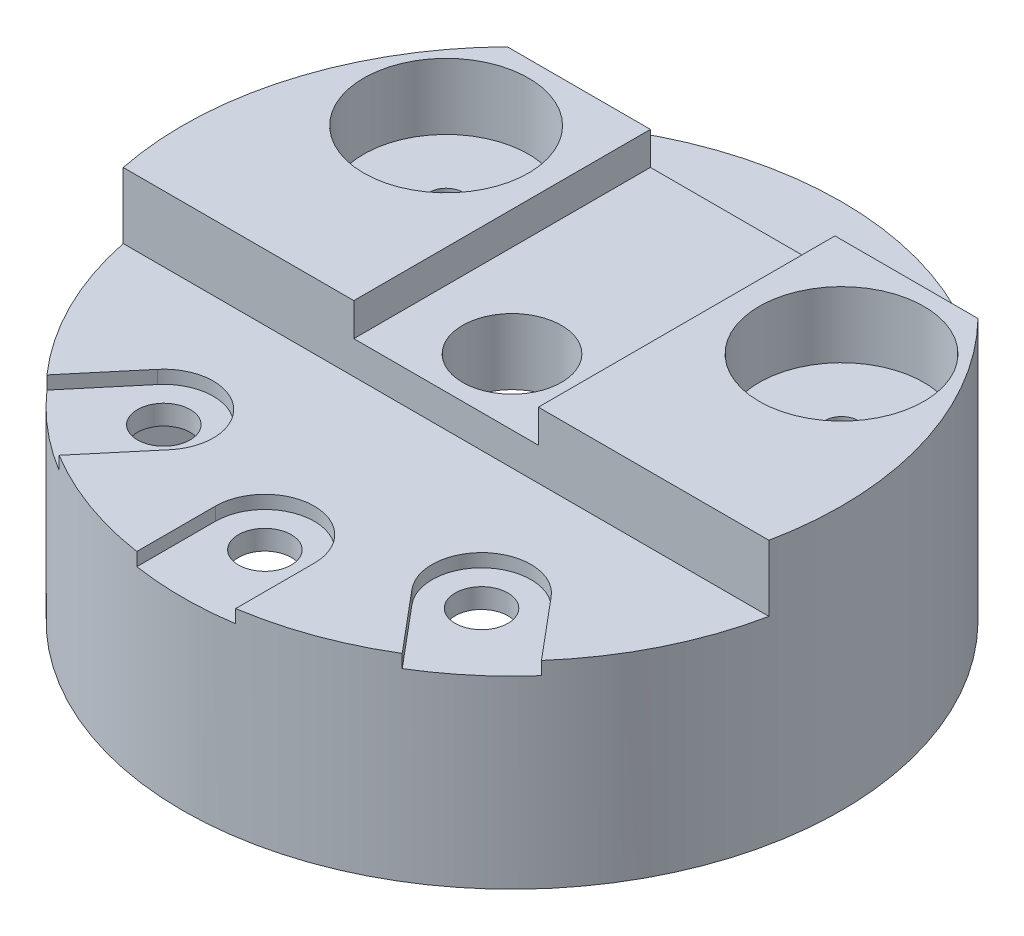
ISO-10303-21;
HEADER;
FILE_DESCRIPTION(('STEP AP214'),'2;1');
FILE_NAME('part.step','',(''),(''),'','','');
FILE_SCHEMA(('AUTOMOTIVE_DESIGN { 1 0 10303 214 1 1 1 1 }'));
ENDSEC;
DATA;
#1=APPLICATION_CONTEXT('core data for automotive mechanical design processes');
#2=APPLICATION_PROTOCOL_DEFINITION('international standard','automotive_design',2000,#1);
#3=PRODUCT_CONTEXT('',#1,'mechanical');
#4=PRODUCT('Part','Part','',(#3));
#5=PRODUCT_RELATED_PRODUCT_CATEGORY('part','',(#4));
#6=PRODUCT_DEFINITION_FORMATION('','',#4);
#7=PRODUCT_DEFINITION_CONTEXT('part definition',#1,'design');
#8=PRODUCT_DEFINITION('design','',#6,#7);
#9=PRODUCT_DEFINITION_SHAPE('','',#8);
#10=(LENGTH_UNIT() NAMED_UNIT(*) SI_UNIT(.MILLI.,.METRE.));
#11=(NAMED_UNIT(*) PLANE_ANGLE_UNIT() SI_UNIT($,.RADIAN.));
#12=(NAMED_UNIT(*) SI_UNIT($,.STERADIAN.) SOLID_ANGLE_UNIT());
#13=UNCERTAINTY_MEASURE_WITH_UNIT(LENGTH_MEASURE(1.E-05),#10,'distance_accuracy_value','');
#14=(GEOMETRIC_REPRESENTATION_CONTEXT(3) GLOBAL_UNCERTAINTY_ASSIGNED_CONTEXT((#13)) GLOBAL_UNIT_ASSIGNED_CONTEXT((#10,
#11,#12)) REPRESENTATION_CONTEXT('',''));
#15=CARTESIAN_POINT('',(0.,0.,0.));
#16=DIRECTION('',(0.,0.,1.));
#17=DIRECTION('',(1.,0.,0.));
#18=AXIS2_PLACEMENT_3D('',#15,#16,#17);
#19=CARTESIAN_POINT('',(0.,2.5,0.));
#20=DIRECTION('',(0.,1.,0.));
#21=DIRECTION('',(0.,0.,1.));
#22=AXIS2_PLACEMENT_3D('',#19,#20,#21);
#23=CYLINDRICAL_SURFACE('',#22,0.75);
#24=CARTESIAN_POINT('',(0.,2.5,0.));
#25=DIRECTION('',(0.,1.,0.));
#26=DIRECTION('',(0.,0.,1.));
#27=AXIS2_PLACEMENT_3D('',#24,#25,#26);
#28=CIRCLE('',#27,0.75);
#29=CARTESIAN_POINT('',(0.,2.5,0.75));
#30=VERTEX_POINT('',#29);
#31=EDGE_CURVE('E345',#30,#30,#28,.T.);
#32=ORIENTED_EDGE('',*,*,#31,.F.);
#33=EDGE_LOOP('',(#32));
#34=FACE_BOUND('',#33,.T.);
#35=CARTESIAN_POINT('',(0.,3.5,0.));
#36=DIRECTION('',(0.,1.,0.));
#37=DIRECTION('',(0.,0.,1.));
#38=AXIS2_PLACEMENT_3D('',#35,#36,#37);
#39=CIRCLE('',#38,0.75);
#40=CARTESIAN_POINT('',(0.,3.5,0.75));
#41=VERTEX_POINT('',#40);
#42=EDGE_CURVE('E280',#41,#41,#39,.F.);
#43=ORIENTED_EDGE('',*,*,#42,.F.);
#44=EDGE_LOOP('',(#43));
#45=FACE_BOUND('',#44,.T.);
#46=ADVANCED_FACE('F34',(#34,#45),#23,.F.);
#47=CARTESIAN_POINT('',(0.,4.,0.));
#48=DIRECTION('',(0.,-1.,0.));
#49=DIRECTION('',(0.,0.,-1.));
#50=AXIS2_PLACEMENT_3D('',#47,#48,#49);
#51=PLANE('',#50);
#52=CARTESIAN_POINT('',(3.,4.,-2.));
#53=DIRECTION('',(0.,1.,0.));
#54=DIRECTION('',(0.,0.,1.));
#55=AXIS2_PLACEMENT_3D('',#52,#53,#54);
#56=CIRCLE('',#55,1.25);
#57=CARTESIAN_POINT('',(3.,4.,-0.749999999999999));
#58=VERTEX_POINT('',#57);
#59=EDGE_CURVE('E309',#58,#58,#56,.T.);
#60=ORIENTED_EDGE('',*,*,#59,.F.);
#61=EDGE_LOOP('',(#60));
#62=FACE_BOUND('',#61,.T.);
#63=DIRECTION('',(-1.,0.,0.));
#64=VECTOR('',#63,1.);
#65=CARTESIAN_POINT('',(-3.57071421427143,4.,-3.5));
#66=LINE('',#65,#64);
#67=CARTESIAN_POINT('',(3.57071421427142,4.,-3.5));
#68=VERTEX_POINT('',#67);
#69=CARTESIAN_POINT('',(1.4,4.,-3.5));
#70=VERTEX_POINT('',#69);
#71=EDGE_CURVE('E326',#68,#70,#66,.T.);
#72=ORIENTED_EDGE('',*,*,#71,.T.);
#73=DIRECTION('',(0.,0.,-1.));
#74=VECTOR('',#73,1.);
#75=CARTESIAN_POINT('',(1.4,4.,-3.5));
#76=LINE('',#75,#74);
#77=CARTESIAN_POINT('',(1.4,4.,1.));
#78=VERTEX_POINT('',#77);
#79=EDGE_CURVE('E262',#78,#70,#76,.T.);
#80=ORIENTED_EDGE('',*,*,#79,.F.);
#81=DIRECTION('',(1.,0.,0.));
#82=VECTOR('',#81,1.);
#83=CARTESIAN_POINT('',(-4.89897948556636,4.,1.));
#84=LINE('',#83,#82);
#85=CARTESIAN_POINT('',(4.89897948556636,4.,1.));
#86=VERTEX_POINT('',#85);
#87=EDGE_CURVE('E318',#78,#86,#84,.T.);
#88=ORIENTED_EDGE('',*,*,#87,.T.);
#89=CARTESIAN_POINT('',(0.,4.,0.));
#90=DIRECTION('',(0.,1.,0.));
#91=DIRECTION('',(0.,0.,1.));
#92=AXIS2_PLACEMENT_3D('',#89,#90,#91);
#93=CIRCLE('',#92,5.);
#94=EDGE_CURVE('E323',#86,#68,#93,.T.);
#95=ORIENTED_EDGE('',*,*,#94,.T.);
#96=EDGE_LOOP('',(#72,#80,#88,#95));
#97=FACE_BOUND('',#96,.T.);
#98=ADVANCED_FACE('F418',(#62,#97),#51,.F.);
#99=CARTESIAN_POINT('',(0.,3.,0.));
#100=DIRECTION('',(0.,1.,0.));
#101=DIRECTION('',(0.,0.,1.));
#102=AXIS2_PLACEMENT_3D('',#99,#100,#101);
#103=PLANE('',#102);
#104=DIRECTION('',(-1.,0.,0.));
#105=VECTOR('',#104,1.);
#106=CARTESIAN_POINT('',(-3.57071421427143,3.,-3.5));
#107=LINE('',#106,#105);
#108=CARTESIAN_POINT('',(3.57071421427142,3.,-3.5));
#109=VERTEX_POINT('',#108);
#110=CARTESIAN_POINT('',(-3.57071421427142,3.,-3.5));
#111=VERTEX_POINT('',#110);
#112=EDGE_CURVE('E319',#109,#111,#107,.T.);
#113=ORIENTED_EDGE('',*,*,#112,.F.);
#114=CARTESIAN_POINT('',(0.,3.,0.));
#115=DIRECTION('',(0.,1.,0.));
#116=DIRECTION('',(0.,0.,1.));
#117=AXIS2_PLACEMENT_3D('',#114,#115,#116);
#118=CIRCLE('',#117,5.);
#119=EDGE_CURVE('E356',#109,#111,#118,.T.);
#120=ORIENTED_EDGE('',*,*,#119,.T.);
#121=EDGE_LOOP('',(#113,#120));
#122=FACE_BOUND('',#121,.T.);
#123=ADVANCED_FACE('F405',(#122),#103,.T.);
#124=CARTESIAN_POINT('',(0.,3.,0.));
#125=DIRECTION('',(0.,-1.,0.));
#126=DIRECTION('',(0.,0.,-1.));
#127=AXIS2_PLACEMENT_3D('',#124,#125,#126);
#128=CYLINDRICAL_SURFACE('',#127,4.75);
#129=CARTESIAN_POINT('',(0.,0.,0.));
#130=DIRECTION('',(0.,1.,0.));
#131=DIRECTION('',(0.,0.,1.));
#132=AXIS2_PLACEMENT_3D('',#129,#130,#131);
#133=CIRCLE('',#132,4.75);
#134=CARTESIAN_POINT('',(0.,0.,4.75));
#135=VERTEX_POINT('',#134);
#136=EDGE_CURVE('E349',#135,#135,#133,.T.);
#137=ORIENTED_EDGE('',*,*,#136,.F.);
#138=EDGE_LOOP('',(#137));
#139=FACE_BOUND('',#138,.T.);
#140=CARTESIAN_POINT('',(0.,2.5,0.));
#141=DIRECTION('',(0.,1.,0.));
#142=DIRECTION('',(0.,0.,1.));
#143=AXIS2_PLACEMENT_3D('',#140,#141,#142);
#144=CIRCLE('',#143,4.75);
#145=CARTESIAN_POINT('',(0.,2.5,4.75));
#146=VERTEX_POINT('',#145);
#147=EDGE_CURVE('E348',#146,#146,#144,.T.);
#148=ORIENTED_EDGE('',*,*,#147,.T.);
#149=EDGE_LOOP('',(#148));
#150=FACE_BOUND('',#149,.T.);
#151=ADVANCED_FACE('F456',(#139,#150),#128,.F.);
#152=DIRECTION('',(-0.642787609686541,0.,0.766044443118977));
#153=VECTOR('',#152,1.);
#154=CARTESIAN_POINT('',(-4.07772580513088,3.,3.69285150773352));
#155=LINE('',#154,#153);
#156=CARTESIAN_POINT('',(-2.98498686866376,3.,2.39057595443126));
#157=VERTEX_POINT('',#156);
#158=CARTESIAN_POINT('',(-3.7521088749711,3.,3.30479636140611));
#159=VERTEX_POINT('',#158);
#160=EDGE_CURVE('E180',#157,#159,#155,.T.);
#161=ORIENTED_EDGE('',*,*,#160,.F.);
#162=CARTESIAN_POINT('',(-2.41045353632453,3.,2.87266666169616));
#163=DIRECTION('',(0.,1.,0.));
#164=DIRECTION('',(0.,0.,-1.));
#165=AXIS2_PLACEMENT_3D('',#162,#163,#164);
#166=CIRCLE('',#165,0.749999999999999);
#167=CARTESIAN_POINT('',(-1.8359202039853,3.,3.35475736896107));
#168=VERTEX_POINT('',#167);
#169=EDGE_CURVE('E198',#168,#157,#166,.T.);
#170=ORIENTED_EDGE('',*,*,#169,.F.);
#171=DIRECTION('',(0.642787609686541,0.,-0.766044443118976));
#172=VECTOR('',#171,1.);
#173=CARTESIAN_POINT('',(-2.92865914045242,3.,4.65703292226333));
#174=LINE('',#173,#172);
#175=CARTESIAN_POINT('',(-2.60304221029264,3.,4.26897777593592));
#176=VERTEX_POINT('',#175);
#177=EDGE_CURVE('E186',#176,#168,#174,.T.);
#178=ORIENTED_EDGE('',*,*,#177,.F.);
#179=CARTESIAN_POINT('',(-0.75,3.,4.9434299833213));
#180=VERTEX_POINT('',#179);
#181=EDGE_CURVE('E357',#176,#180,#118,.T.);
#182=ORIENTED_EDGE('',*,*,#181,.T.);
#183=DIRECTION('',(0.,0.,1.));
#184=VECTOR('',#183,1.);
#185=CARTESIAN_POINT('',(-0.75,3.,3.75));
#186=LINE('',#185,#184);
#187=CARTESIAN_POINT('',(-0.75,3.,3.75));
#188=VERTEX_POINT('',#187);
#189=EDGE_CURVE('E242',#188,#180,#186,.T.);
#190=ORIENTED_EDGE('',*,*,#189,.F.);
#191=CARTESIAN_POINT('',(0.,3.,3.75));
#192=DIRECTION('',(0.,1.,0.));
#193=DIRECTION('',(0.,0.,-1.));
#194=AXIS2_PLACEMENT_3D('',#191,#192,#193);
#195=CIRCLE('',#194,0.75);
#196=CARTESIAN_POINT('',(0.75,3.,3.75));
#197=VERTEX_POINT('',#196);
#198=EDGE_CURVE('E230',#197,#188,#195,.T.);
#199=ORIENTED_EDGE('',*,*,#198,.F.);
#200=DIRECTION('',(0.,0.,-1.));
#201=VECTOR('',#200,1.);
#202=CARTESIAN_POINT('',(0.75,3.,5.45));
#203=LINE('',#202,#201);
#204=CARTESIAN_POINT('',(0.75,3.,4.9434299833213));
#205=VERTEX_POINT('',#204);
#206=EDGE_CURVE('E235',#205,#197,#203,.T.);
#207=ORIENTED_EDGE('',*,*,#206,.F.);
#208=CARTESIAN_POINT('',(2.60304221029264,3.,4.26897777593592));
#209=VERTEX_POINT('',#208);
#210=EDGE_CURVE('E406',#205,#209,#118,.T.);
#211=ORIENTED_EDGE('',*,*,#210,.T.);
#212=DIRECTION('',(0.642787609686541,0.,0.766044443118977));
#213=VECTOR('',#212,1.);
#214=CARTESIAN_POINT('',(1.8359202039853,3.,3.35475736896107));
#215=LINE('',#214,#213);
#216=CARTESIAN_POINT('',(1.8359202039853,3.,3.35475736896107));
#217=VERTEX_POINT('',#216);
#218=EDGE_CURVE('E216',#217,#209,#215,.T.);
#219=ORIENTED_EDGE('',*,*,#218,.F.);
#220=CARTESIAN_POINT('',(2.41045353632453,3.,2.87266666169616));
#221=DIRECTION('',(0.,1.,0.));
#222=DIRECTION('',(0.,0.,-1.));
#223=AXIS2_PLACEMENT_3D('',#220,#221,#222);
#224=CIRCLE('',#223,0.749999999999999);
#225=CARTESIAN_POINT('',(2.98498686866376,3.,2.39057595443126));
#226=VERTEX_POINT('',#225);
#227=EDGE_CURVE('E206',#226,#217,#224,.T.);
#228=ORIENTED_EDGE('',*,*,#227,.F.);
#229=DIRECTION('',(-0.642787609686541,0.,-0.766044443118977));
#230=VECTOR('',#229,1.);
#231=CARTESIAN_POINT('',(2.98498686866376,3.,2.39057595443126));
#232=LINE('',#231,#230);
#233=CARTESIAN_POINT('',(3.75210887497111,3.,3.30479636140611));
#234=VERTEX_POINT('',#233);
#235=EDGE_CURVE('E209',#234,#226,#232,.T.);
#236=ORIENTED_EDGE('',*,*,#235,.F.);
#237=CARTESIAN_POINT('',(4.89897948556636,3.,1.));
#238=VERTEX_POINT('',#237);
#239=EDGE_CURVE('E360',#234,#238,#118,.T.);
#240=ORIENTED_EDGE('',*,*,#239,.T.);
#241=DIRECTION('',(1.,0.,0.));
#242=VECTOR('',#241,1.);
#243=CARTESIAN_POINT('',(-4.89897948556636,3.,1.));
#244=LINE('',#243,#242);
#245=CARTESIAN_POINT('',(-4.89897948556636,3.,1.));
#246=VERTEX_POINT('',#245);
#247=EDGE_CURVE('E312',#246,#238,#244,.T.);
#248=ORIENTED_EDGE('',*,*,#247,.F.);
#249=EDGE_CURVE('E353',#246,#159,#118,.T.);
#250=ORIENTED_EDGE('',*,*,#249,.T.);
#251=EDGE_LOOP('',(#161,#170,#178,#182,#190,#199,#207,#211,#219,#228,#236,#240,#248,#250));
#252=FACE_BOUND('',#251,.T.);
#253=ADVANCED_FACE('F379',(#252),#103,.T.);
#254=CARTESIAN_POINT('',(0.,0.,0.));
#255=DIRECTION('',(0.,1.,0.));
#256=DIRECTION('',(0.,0.,1.));
#257=AXIS2_PLACEMENT_3D('',#254,#255,#256);
#258=PLANE('',#257);
#259=CARTESIAN_POINT('',(0.,0.,0.));
#260=DIRECTION('',(0.,1.,0.));
#261=DIRECTION('',(0.,0.,1.));
#262=AXIS2_PLACEMENT_3D('',#259,#260,#261);
#263=CIRCLE('',#262,5.);
#264=CARTESIAN_POINT('',(0.,0.,5.));
#265=VERTEX_POINT('',#264);
#266=EDGE_CURVE('E352',#265,#265,#263,.T.);
#267=ORIENTED_EDGE('',*,*,#266,.F.);
#268=EDGE_LOOP('',(#267));
#269=FACE_BOUND('',#268,.T.);
#270=ORIENTED_EDGE('',*,*,#136,.T.);
#271=EDGE_LOOP('',(#270));
#272=FACE_BOUND('',#271,.T.);
#273=ADVANCED_FACE('F461',(#269,#272),#258,.F.);
#274=CARTESIAN_POINT('',(0.,3.,0.));
#275=DIRECTION('',(0.,-1.,0.));
#276=DIRECTION('',(0.,0.,-1.));
#277=AXIS2_PLACEMENT_3D('',#274,#275,#276);
#278=CYLINDRICAL_SURFACE('',#277,5.);
#279=CARTESIAN_POINT('',(0.,2.8,0.));
#280=DIRECTION('',(0.,-1.,0.));
#281=DIRECTION('',(0.,0.,-1.));
#282=AXIS2_PLACEMENT_3D('',#279,#280,#281);
#283=CIRCLE('',#282,5.);
#284=CARTESIAN_POINT('',(-2.60304221029264,2.8,4.26897777593592));
#285=VERTEX_POINT('',#284);
#286=CARTESIAN_POINT('',(-3.7521088749711,2.8,3.30479636140611));
#287=VERTEX_POINT('',#286);
#288=EDGE_CURVE('E177',#285,#287,#283,.T.);
#289=ORIENTED_EDGE('',*,*,#288,.T.);
#290=DIRECTION('',(0.,-1.,0.));
#291=VECTOR('',#290,1.);
#292=CARTESIAN_POINT('',(-3.7521088749711,3.,3.30479636140611));
#293=LINE('',#292,#291);
#294=EDGE_CURVE('E11',#287,#159,#293,.F.);
#295=ORIENTED_EDGE('',*,*,#294,.T.);
#296=ORIENTED_EDGE('',*,*,#249,.F.);
#297=DIRECTION('',(0.,-1.,0.));
#298=VECTOR('',#297,1.);
#299=CARTESIAN_POINT('',(-4.89897948556636,4.,1.));
#300=LINE('',#299,#298);
#301=CARTESIAN_POINT('',(-4.89897948556636,4.,1.));
#302=VERTEX_POINT('',#301);
#303=EDGE_CURVE('E342',#302,#246,#300,.T.);
#304=ORIENTED_EDGE('',*,*,#303,.F.);
#305=CARTESIAN_POINT('',(0.,4.,0.));
#306=DIRECTION('',(0.,1.,0.));
#307=DIRECTION('',(0.,0.,-1.));
#308=AXIS2_PLACEMENT_3D('',#305,#306,#307);
#309=CIRCLE('',#308,5.);
#310=CARTESIAN_POINT('',(-3.57071421427143,4.,-3.5));
#311=VERTEX_POINT('',#310);
#312=EDGE_CURVE('E315',#311,#302,#309,.T.);
#313=ORIENTED_EDGE('',*,*,#312,.F.);
#314=DIRECTION('',(0.,-1.,0.));
#315=VECTOR('',#314,1.);
#316=CARTESIAN_POINT('',(-3.57071421427143,4.,-3.5));
#317=LINE('',#316,#315);
#318=EDGE_CURVE('E329',#311,#111,#317,.T.);
#319=ORIENTED_EDGE('',*,*,#318,.T.);
#320=ORIENTED_EDGE('',*,*,#119,.F.);
#321=DIRECTION('',(0.,-1.,0.));
#322=VECTOR('',#321,1.);
#323=CARTESIAN_POINT('',(3.57071421427142,4.,-3.5));
#324=LINE('',#323,#322);
#325=EDGE_CURVE('E336',#68,#109,#324,.T.);
#326=ORIENTED_EDGE('',*,*,#325,.F.);
#327=ORIENTED_EDGE('',*,*,#94,.F.);
#328=DIRECTION('',(0.,-1.,0.));
#329=VECTOR('',#328,1.);
#330=CARTESIAN_POINT('',(4.89897948556636,4.,1.));
#331=LINE('',#330,#329);
#332=EDGE_CURVE('E339',#86,#238,#331,.T.);
#333=ORIENTED_EDGE('',*,*,#332,.T.);
#334=ORIENTED_EDGE('',*,*,#239,.F.);
#335=DIRECTION('',(0.,-1.,0.));
#336=VECTOR('',#335,1.);
#337=CARTESIAN_POINT('',(3.75210887497111,3.,3.30479636140611));
#338=LINE('',#337,#336);
#339=CARTESIAN_POINT('',(3.75210887497111,2.8,3.30479636140611));
#340=VERTEX_POINT('',#339);
#341=EDGE_CURVE('E372',#234,#340,#338,.T.);
#342=ORIENTED_EDGE('',*,*,#341,.T.);
#343=CARTESIAN_POINT('',(0.,2.8,0.));
#344=DIRECTION('',(0.,-1.,0.));
#345=DIRECTION('',(0.,0.,-1.));
#346=AXIS2_PLACEMENT_3D('',#343,#344,#345);
#347=CIRCLE('',#346,5.);
#348=CARTESIAN_POINT('',(2.60304221029264,2.8,4.26897777593592));
#349=VERTEX_POINT('',#348);
#350=EDGE_CURVE('E224',#340,#349,#347,.T.);
#351=ORIENTED_EDGE('',*,*,#350,.T.);
#352=DIRECTION('',(0.,-1.,0.));
#353=VECTOR('',#352,1.);
#354=CARTESIAN_POINT('',(2.60304221029264,3.,4.26897777593592));
#355=LINE('',#354,#353);
#356=EDGE_CURVE('E369',#349,#209,#355,.F.);
#357=ORIENTED_EDGE('',*,*,#356,.T.);
#358=ORIENTED_EDGE('',*,*,#210,.F.);
#359=DIRECTION('',(0.,-1.,0.));
#360=VECTOR('',#359,1.);
#361=CARTESIAN_POINT('',(0.75,3.,4.9434299833213));
#362=LINE('',#361,#360);
#363=CARTESIAN_POINT('',(0.75,2.8,4.9434299833213));
#364=VERTEX_POINT('',#363);
#365=EDGE_CURVE('E366',#205,#364,#362,.T.);
#366=ORIENTED_EDGE('',*,*,#365,.T.);
#367=CARTESIAN_POINT('',(0.,2.8,0.));
#368=DIRECTION('',(0.,-1.,0.));
#369=DIRECTION('',(0.,0.,-1.));
#370=AXIS2_PLACEMENT_3D('',#367,#368,#369);
#371=CIRCLE('',#370,5.);
#372=CARTESIAN_POINT('',(-0.75,2.8,4.9434299833213));
#373=VERTEX_POINT('',#372);
#374=EDGE_CURVE('E249',#364,#373,#371,.T.);
#375=ORIENTED_EDGE('',*,*,#374,.T.);
#376=DIRECTION('',(0.,-1.,0.));
#377=VECTOR('',#376,1.);
#378=CARTESIAN_POINT('',(-0.75,3.,4.9434299833213));
#379=LINE('',#378,#377);
#380=EDGE_CURVE('E363',#373,#180,#379,.F.);
#381=ORIENTED_EDGE('',*,*,#380,.T.);
#382=ORIENTED_EDGE('',*,*,#181,.F.);
#383=DIRECTION('',(0.,-1.,0.));
#384=VECTOR('',#383,1.);
#385=CARTESIAN_POINT('',(-2.60304221029264,3.,4.26897777593592));
#386=LINE('',#385,#384);
#387=EDGE_CURVE('E42',#176,#285,#386,.T.);
#388=ORIENTED_EDGE('',*,*,#387,.T.);
#389=EDGE_LOOP('',(#289,#295,#296,#304,#313,#319,#320,#326,#327,#333,#334,#342,#351,#357,#358,
#366,#375,#381,#382,#388));
#390=FACE_BOUND('',#389,.T.);
#391=ORIENTED_EDGE('',*,*,#266,.T.);
#392=EDGE_LOOP('',(#391));
#393=FACE_BOUND('',#392,.T.);
#394=ADVANCED_FACE('F36',(#390,#393),#278,.T.);
#395=CARTESIAN_POINT('',(0.,2.5,0.));
#396=DIRECTION('',(0.,1.,0.));
#397=DIRECTION('',(0.,0.,1.));
#398=AXIS2_PLACEMENT_3D('',#395,#396,#397);
#399=PLANE('',#398);
#400=CARTESIAN_POINT('',(0.,2.5,3.75));
#401=DIRECTION('',(0.,1.,0.));
#402=DIRECTION('',(0.,0.,1.));
#403=AXIS2_PLACEMENT_3D('',#400,#401,#402);
#404=CIRCLE('',#403,0.4);
#405=CARTESIAN_POINT('',(0.,2.5,4.15));
#406=VERTEX_POINT('',#405);
#407=EDGE_CURVE('E254',#406,#406,#404,.F.);
#408=ORIENTED_EDGE('',*,*,#407,.F.);
#409=EDGE_LOOP('',(#408));
#410=FACE_BOUND('',#409,.T.);
#411=CARTESIAN_POINT('',(-2.41045353632453,2.5,2.87266666169616));
#412=DIRECTION('',(0.,1.,0.));
#413=DIRECTION('',(0.,0.,1.));
#414=AXIS2_PLACEMENT_3D('',#411,#412,#413);
#415=CIRCLE('',#414,0.4);
#416=CARTESIAN_POINT('',(-2.41045353632453,2.5,3.27266666169616));
#417=VERTEX_POINT('',#416);
#418=EDGE_CURVE('E253',#417,#417,#415,.F.);
#419=ORIENTED_EDGE('',*,*,#418,.F.);
#420=EDGE_LOOP('',(#419));
#421=FACE_BOUND('',#420,.T.);
#422=CARTESIAN_POINT('',(2.41045353632453,2.5,2.87266666169616));
#423=DIRECTION('',(0.,1.,0.));
#424=DIRECTION('',(0.,0.,1.));
#425=AXIS2_PLACEMENT_3D('',#422,#423,#424);
#426=CIRCLE('',#425,0.4);
#427=CARTESIAN_POINT('',(2.41045353632453,2.5,3.27266666169616));
#428=VERTEX_POINT('',#427);
#429=EDGE_CURVE('E257',#428,#428,#426,.F.);
#430=ORIENTED_EDGE('',*,*,#429,.F.);
#431=EDGE_LOOP('',(#430));
#432=FACE_BOUND('',#431,.T.);
#433=CARTESIAN_POINT('',(3.,2.5,-2.));
#434=DIRECTION('',(0.,1.,0.));
#435=DIRECTION('',(0.,0.,1.));
#436=AXIS2_PLACEMENT_3D('',#433,#434,#435);
#437=CIRCLE('',#436,0.25);
#438=CARTESIAN_POINT('',(3.,2.5,-1.75));
#439=VERTEX_POINT('',#438);
#440=EDGE_CURVE('E293',#439,#439,#437,.F.);
#441=ORIENTED_EDGE('',*,*,#440,.F.);
#442=EDGE_LOOP('',(#441));
#443=FACE_BOUND('',#442,.T.);
#444=CARTESIAN_POINT('',(-3.,2.5,-2.));
#445=DIRECTION('',(0.,1.,0.));
#446=DIRECTION('',(0.,0.,1.));
#447=AXIS2_PLACEMENT_3D('',#444,#445,#446);
#448=CIRCLE('',#447,0.25);
#449=CARTESIAN_POINT('',(-3.,2.5,-1.75));
#450=VERTEX_POINT('',#449);
#451=EDGE_CURVE('E299',#450,#450,#448,.F.);
#452=ORIENTED_EDGE('',*,*,#451,.F.);
#453=EDGE_LOOP('',(#452));
#454=FACE_BOUND('',#453,.T.);
#455=ORIENTED_EDGE('',*,*,#31,.T.);
#456=EDGE_LOOP('',(#455));
#457=FACE_BOUND('',#456,.T.);
#458=ORIENTED_EDGE('',*,*,#147,.F.);
#459=EDGE_LOOP('',(#458));
#460=FACE_BOUND('',#459,.T.);
#461=ADVANCED_FACE('F452',(#410,#421,#432,#443,#454,#457,#460),#399,.F.);
#462=CARTESIAN_POINT('',(-1.4,4.,1.));
#463=VERTEX_POINT('',#462);
#464=EDGE_CURVE('E320',#302,#463,#84,.T.);
#465=ORIENTED_EDGE('',*,*,#464,.T.);
#466=DIRECTION('',(0.,0.,1.));
#467=VECTOR('',#466,1.);
#468=CARTESIAN_POINT('',(-1.4,4.,-3.5));
#469=LINE('',#468,#467);
#470=CARTESIAN_POINT('',(-1.4,4.,-3.5));
#471=VERTEX_POINT('',#470);
#472=EDGE_CURVE('E266',#471,#463,#469,.T.);
#473=ORIENTED_EDGE('',*,*,#472,.F.);
#474=EDGE_CURVE('E325',#471,#311,#66,.T.);
#475=ORIENTED_EDGE('',*,*,#474,.T.);
#476=ORIENTED_EDGE('',*,*,#312,.T.);
#477=EDGE_LOOP('',(#465,#473,#475,#476));
#478=FACE_BOUND('',#477,.T.);
#479=CARTESIAN_POINT('',(-3.,4.,-2.));
#480=DIRECTION('',(0.,1.,0.));
#481=DIRECTION('',(0.,0.,1.));
#482=AXIS2_PLACEMENT_3D('',#479,#480,#481);
#483=CIRCLE('',#482,1.25);
#484=CARTESIAN_POINT('',(-3.,4.,-0.749999999999999));
#485=VERTEX_POINT('',#484);
#486=EDGE_CURVE('E303',#485,#485,#483,.T.);
#487=ORIENTED_EDGE('',*,*,#486,.F.);
#488=EDGE_LOOP('',(#487));
#489=FACE_BOUND('',#488,.T.);
#490=ADVANCED_FACE('F393',(#478,#489),#51,.F.);
#491=CARTESIAN_POINT('',(-4.89897948556636,4.,1.));
#492=DIRECTION('',(0.,0.,-1.));
#493=DIRECTION('',(-1.,0.,0.));
#494=AXIS2_PLACEMENT_3D('',#491,#492,#493);
#495=PLANE('',#494);
#496=ORIENTED_EDGE('',*,*,#87,.F.);
#497=DIRECTION('',(0.,1.,0.));
#498=VECTOR('',#497,1.);
#499=CARTESIAN_POINT('',(1.4,3.5,1.));
#500=LINE('',#499,#498);
#501=CARTESIAN_POINT('',(1.4,3.5,1.));
#502=VERTEX_POINT('',#501);
#503=EDGE_CURVE('E278',#502,#78,#500,.T.);
#504=ORIENTED_EDGE('',*,*,#503,.F.);
#505=DIRECTION('',(1.,0.,0.));
#506=VECTOR('',#505,1.);
#507=CARTESIAN_POINT('',(-1.4,3.5,1.));
#508=LINE('',#507,#506);
#509=CARTESIAN_POINT('',(-1.4,3.5,1.));
#510=VERTEX_POINT('',#509);
#511=EDGE_CURVE('E272',#510,#502,#508,.T.);
#512=ORIENTED_EDGE('',*,*,#511,.F.);
#513=DIRECTION('',(0.,1.,0.));
#514=VECTOR('',#513,1.);
#515=CARTESIAN_POINT('',(-1.4,3.5,1.));
#516=LINE('',#515,#514);
#517=EDGE_CURVE('E281',#510,#463,#516,.T.);
#518=ORIENTED_EDGE('',*,*,#517,.T.);
#519=ORIENTED_EDGE('',*,*,#464,.F.);
#520=ORIENTED_EDGE('',*,*,#303,.T.);
#521=ORIENTED_EDGE('',*,*,#247,.T.);
#522=ORIENTED_EDGE('',*,*,#332,.F.);
#523=EDGE_LOOP('',(#496,#504,#512,#518,#519,#520,#521,#522));
#524=FACE_BOUND('',#523,.T.);
#525=ADVANCED_FACE('F388',(#524),#495,.F.);
#526=CARTESIAN_POINT('',(-3.57071421427143,4.,-3.5));
#527=DIRECTION('',(0.,0.,1.));
#528=DIRECTION('',(1.,0.,0.));
#529=AXIS2_PLACEMENT_3D('',#526,#527,#528);
#530=PLANE('',#529);
#531=DIRECTION('',(-1.,0.,0.));
#532=VECTOR('',#531,1.);
#533=CARTESIAN_POINT('',(-1.4,3.5,-3.5));
#534=LINE('',#533,#532);
#535=CARTESIAN_POINT('',(1.4,3.5,-3.5));
#536=VERTEX_POINT('',#535);
#537=CARTESIAN_POINT('',(-1.4,3.5,-3.5));
#538=VERTEX_POINT('',#537);
#539=EDGE_CURVE('E265',#536,#538,#534,.T.);
#540=ORIENTED_EDGE('',*,*,#539,.F.);
#541=DIRECTION('',(0.,1.,0.));
#542=VECTOR('',#541,1.);
#543=CARTESIAN_POINT('',(1.4,3.5,-3.5));
#544=LINE('',#543,#542);
#545=EDGE_CURVE('E275',#536,#70,#544,.T.);
#546=ORIENTED_EDGE('',*,*,#545,.T.);
#547=ORIENTED_EDGE('',*,*,#71,.F.);
#548=ORIENTED_EDGE('',*,*,#325,.T.);
#549=ORIENTED_EDGE('',*,*,#112,.T.);
#550=ORIENTED_EDGE('',*,*,#318,.F.);
#551=ORIENTED_EDGE('',*,*,#474,.F.);
#552=DIRECTION('',(0.,1.,0.));
#553=VECTOR('',#552,1.);
#554=CARTESIAN_POINT('',(-1.4,3.5,-3.5));
#555=LINE('',#554,#553);
#556=EDGE_CURVE('E284',#538,#471,#555,.T.);
#557=ORIENTED_EDGE('',*,*,#556,.F.);
#558=EDGE_LOOP('',(#540,#546,#547,#548,#549,#550,#551,#557));
#559=FACE_BOUND('',#558,.T.);
#560=ADVANCED_FACE('F401',(#559),#530,.F.);
#561=CARTESIAN_POINT('',(3.,4.,-2.));
#562=DIRECTION('',(0.,-1.,0.));
#563=DIRECTION('',(0.,0.,-1.));
#564=AXIS2_PLACEMENT_3D('',#561,#562,#563);
#565=CYLINDRICAL_SURFACE('',#564,1.25);
#566=ORIENTED_EDGE('',*,*,#59,.T.);
#567=EDGE_LOOP('',(#566));
#568=FACE_BOUND('',#567,.T.);
#569=CARTESIAN_POINT('',(3.,3.,-2.));
#570=DIRECTION('',(0.,1.,0.));
#571=DIRECTION('',(0.,0.,1.));
#572=AXIS2_PLACEMENT_3D('',#569,#570,#571);
#573=CIRCLE('',#572,1.25);
#574=CARTESIAN_POINT('',(3.,3.,-0.749999999999999));
#575=VERTEX_POINT('',#574);
#576=EDGE_CURVE('E306',#575,#575,#573,.T.);
#577=ORIENTED_EDGE('',*,*,#576,.F.);
#578=EDGE_LOOP('',(#577));
#579=FACE_BOUND('',#578,.T.);
#580=ADVANCED_FACE('F500',(#568,#579),#565,.F.);
#581=CARTESIAN_POINT('',(-3.,4.,-2.));
#582=DIRECTION('',(0.,-1.,0.));
#583=DIRECTION('',(0.,0.,-1.));
#584=AXIS2_PLACEMENT_3D('',#581,#582,#583);
#585=CYLINDRICAL_SURFACE('',#584,1.25);
#586=ORIENTED_EDGE('',*,*,#486,.T.);
#587=EDGE_LOOP('',(#586));
#588=FACE_BOUND('',#587,.T.);
#589=CARTESIAN_POINT('',(-3.,3.,-2.));
#590=DIRECTION('',(0.,1.,0.));
#591=DIRECTION('',(0.,0.,1.));
#592=AXIS2_PLACEMENT_3D('',#589,#590,#591);
#593=CIRCLE('',#592,1.25);
#594=CARTESIAN_POINT('',(-3.,3.,-0.749999999999999));
#595=VERTEX_POINT('',#594);
#596=EDGE_CURVE('E302',#595,#595,#593,.T.);
#597=ORIENTED_EDGE('',*,*,#596,.F.);
#598=EDGE_LOOP('',(#597));
#599=FACE_BOUND('',#598,.T.);
#600=ADVANCED_FACE('F507',(#588,#599),#585,.F.);
#601=CARTESIAN_POINT('',(3.,3.,-2.));
#602=DIRECTION('',(0.,1.,0.));
#603=DIRECTION('',(0.,0.,1.));
#604=AXIS2_PLACEMENT_3D('',#601,#602,#603);
#605=CIRCLE('',#604,0.25);
#606=CARTESIAN_POINT('',(3.,3.,-1.75));
#607=VERTEX_POINT('',#606);
#608=EDGE_CURVE('E290',#607,#607,#605,.T.);
#609=ORIENTED_EDGE('',*,*,#608,.F.);
#610=EDGE_LOOP('',(#609));
#611=FACE_BOUND('',#610,.T.);
#612=ORIENTED_EDGE('',*,*,#576,.T.);
#613=EDGE_LOOP('',(#612));
#614=FACE_BOUND('',#613,.T.);
#615=ADVANCED_FACE('F462',(#611,#614),#103,.T.);
#616=CARTESIAN_POINT('',(-3.,3.,-2.));
#617=DIRECTION('',(0.,1.,0.));
#618=DIRECTION('',(0.,0.,1.));
#619=AXIS2_PLACEMENT_3D('',#616,#617,#618);
#620=CIRCLE('',#619,0.25);
#621=CARTESIAN_POINT('',(-3.,3.,-1.75));
#622=VERTEX_POINT('',#621);
#623=EDGE_CURVE('E296',#622,#622,#620,.T.);
#624=ORIENTED_EDGE('',*,*,#623,.F.);
#625=EDGE_LOOP('',(#624));
#626=FACE_BOUND('',#625,.T.);
#627=ORIENTED_EDGE('',*,*,#596,.T.);
#628=EDGE_LOOP('',(#627));
#629=FACE_BOUND('',#628,.T.);
#630=ADVANCED_FACE('F463',(#626,#629),#103,.T.);
#631=CARTESIAN_POINT('',(-3.,1.79289321881345,-2.));
#632=DIRECTION('',(0.,1.,0.));
#633=DIRECTION('',(0.,0.,1.));
#634=AXIS2_PLACEMENT_3D('',#631,#632,#633);
#635=CYLINDRICAL_SURFACE('',#634,0.25);
#636=ORIENTED_EDGE('',*,*,#451,.T.);
#637=EDGE_LOOP('',(#636));
#638=FACE_BOUND('',#637,.T.);
#639=ORIENTED_EDGE('',*,*,#623,.T.);
#640=EDGE_LOOP('',(#639));
#641=FACE_BOUND('',#640,.T.);
#642=ADVANCED_FACE('F529',(#638,#641),#635,.F.);
#643=CARTESIAN_POINT('',(3.,1.79289321881345,-2.));
#644=DIRECTION('',(0.,1.,0.));
#645=DIRECTION('',(0.,0.,1.));
#646=AXIS2_PLACEMENT_3D('',#643,#644,#645);
#647=CYLINDRICAL_SURFACE('',#646,0.25);
#648=ORIENTED_EDGE('',*,*,#440,.T.);
#649=EDGE_LOOP('',(#648));
#650=FACE_BOUND('',#649,.T.);
#651=ORIENTED_EDGE('',*,*,#608,.T.);
#652=EDGE_LOOP('',(#651));
#653=FACE_BOUND('',#652,.T.);
#654=ADVANCED_FACE('F536',(#650,#653),#647,.F.);
#655=CARTESIAN_POINT('',(0.,3.5,0.));
#656=DIRECTION('',(0.,1.,0.));
#657=DIRECTION('',(0.,0.,1.));
#658=AXIS2_PLACEMENT_3D('',#655,#656,#657);
#659=PLANE('',#658);
#660=DIRECTION('',(0.,0.,-1.));
#661=VECTOR('',#660,1.);
#662=CARTESIAN_POINT('',(1.4,3.5,-3.5));
#663=LINE('',#662,#661);
#664=EDGE_CURVE('E263',#502,#536,#663,.T.);
#665=ORIENTED_EDGE('',*,*,#664,.T.);
#666=ORIENTED_EDGE('',*,*,#539,.T.);
#667=DIRECTION('',(0.,0.,1.));
#668=VECTOR('',#667,1.);
#669=CARTESIAN_POINT('',(-1.4,3.5,-3.5));
#670=LINE('',#669,#668);
#671=EDGE_CURVE('E269',#538,#510,#670,.T.);
#672=ORIENTED_EDGE('',*,*,#671,.T.);
#673=ORIENTED_EDGE('',*,*,#511,.T.);
#674=EDGE_LOOP('',(#665,#666,#672,#673));
#675=FACE_BOUND('',#674,.T.);
#676=ORIENTED_EDGE('',*,*,#42,.T.);
#677=EDGE_LOOP('',(#676));
#678=FACE_BOUND('',#677,.T.);
#679=ADVANCED_FACE('F423',(#675,#678),#659,.T.);
#680=CARTESIAN_POINT('',(1.4,3.5,-3.5));
#681=DIRECTION('',(1.,0.,0.));
#682=DIRECTION('',(0.,0.,-1.));
#683=AXIS2_PLACEMENT_3D('',#680,#681,#682);
#684=PLANE('',#683);
#685=ORIENTED_EDGE('',*,*,#79,.T.);
#686=ORIENTED_EDGE('',*,*,#545,.F.);
#687=ORIENTED_EDGE('',*,*,#664,.F.);
#688=ORIENTED_EDGE('',*,*,#503,.T.);
#689=EDGE_LOOP('',(#685,#686,#687,#688));
#690=FACE_BOUND('',#689,.T.);
#691=ADVANCED_FACE('F421',(#690),#684,.F.);
#692=CARTESIAN_POINT('',(-1.4,3.5,-3.5));
#693=DIRECTION('',(-1.,0.,0.));
#694=DIRECTION('',(0.,0.,1.));
#695=AXIS2_PLACEMENT_3D('',#692,#693,#694);
#696=PLANE('',#695);
#697=ORIENTED_EDGE('',*,*,#472,.T.);
#698=ORIENTED_EDGE('',*,*,#517,.F.);
#699=ORIENTED_EDGE('',*,*,#671,.F.);
#700=ORIENTED_EDGE('',*,*,#556,.T.);
#701=EDGE_LOOP('',(#697,#698,#699,#700));
#702=FACE_BOUND('',#701,.T.);
#703=ADVANCED_FACE('F426',(#702),#696,.F.);
#704=CARTESIAN_POINT('',(2.41045353632453,1.36862915010152,2.87266666169616));
#705=DIRECTION('',(0.,1.,0.));
#706=DIRECTION('',(0.,0.,1.));
#707=AXIS2_PLACEMENT_3D('',#704,#705,#706);
#708=CYLINDRICAL_SURFACE('',#707,0.4);
#709=CARTESIAN_POINT('',(2.41045353632453,2.8,2.87266666169616));
#710=DIRECTION('',(0.,1.,0.));
#711=DIRECTION('',(0.,0.,1.));
#712=AXIS2_PLACEMENT_3D('',#709,#710,#711);
#713=CIRCLE('',#712,0.4);
#714=CARTESIAN_POINT('',(2.41045353632453,2.8,3.27266666169616));
#715=VERTEX_POINT('',#714);
#716=EDGE_CURVE('E203',#715,#715,#713,.T.);
#717=ORIENTED_EDGE('',*,*,#716,.T.);
#718=EDGE_LOOP('',(#717));
#719=FACE_BOUND('',#718,.T.);
#720=ORIENTED_EDGE('',*,*,#429,.T.);
#721=EDGE_LOOP('',(#720));
#722=FACE_BOUND('',#721,.T.);
#723=ADVANCED_FACE('F428',(#719,#722),#708,.F.);
#724=CARTESIAN_POINT('',(-2.41045353632453,1.36862915010152,2.87266666169616));
#725=DIRECTION('',(0.,1.,0.));
#726=DIRECTION('',(0.,0.,1.));
#727=AXIS2_PLACEMENT_3D('',#724,#725,#726);
#728=CYLINDRICAL_SURFACE('',#727,0.4);
#729=CARTESIAN_POINT('',(-2.41045353632453,2.8,2.87266666169616));
#730=DIRECTION('',(0.,1.,0.));
#731=DIRECTION('',(0.,0.,1.));
#732=AXIS2_PLACEMENT_3D('',#729,#730,#731);
#733=CIRCLE('',#732,0.4);
#734=CARTESIAN_POINT('',(-2.41045353632453,2.8,3.27266666169616));
#735=VERTEX_POINT('',#734);
#736=EDGE_CURVE('E199',#735,#735,#733,.T.);
#737=ORIENTED_EDGE('',*,*,#736,.T.);
#738=EDGE_LOOP('',(#737));
#739=FACE_BOUND('',#738,.T.);
#740=ORIENTED_EDGE('',*,*,#418,.T.);
#741=EDGE_LOOP('',(#740));
#742=FACE_BOUND('',#741,.T.);
#743=ADVANCED_FACE('F434',(#739,#742),#728,.F.);
#744=CARTESIAN_POINT('',(0.,1.36862915010152,3.75));
#745=DIRECTION('',(0.,1.,0.));
#746=DIRECTION('',(0.,0.,1.));
#747=AXIS2_PLACEMENT_3D('',#744,#745,#746);
#748=CYLINDRICAL_SURFACE('',#747,0.4);
#749=CARTESIAN_POINT('',(0.,2.8,3.75));
#750=DIRECTION('',(0.,1.,0.));
#751=DIRECTION('',(0.,0.,1.));
#752=AXIS2_PLACEMENT_3D('',#749,#750,#751);
#753=CIRCLE('',#752,0.4);
#754=CARTESIAN_POINT('',(0.,2.8,4.15));
#755=VERTEX_POINT('',#754);
#756=EDGE_CURVE('E227',#755,#755,#753,.T.);
#757=ORIENTED_EDGE('',*,*,#756,.T.);
#758=EDGE_LOOP('',(#757));
#759=FACE_BOUND('',#758,.T.);
#760=ORIENTED_EDGE('',*,*,#407,.T.);
#761=EDGE_LOOP('',(#760));
#762=FACE_BOUND('',#761,.T.);
#763=ADVANCED_FACE('F571',(#759,#762),#748,.F.);
#764=CARTESIAN_POINT('',(0.75,2.8,5.45));
#765=DIRECTION('',(1.,0.,0.));
#766=DIRECTION('',(0.,0.,-1.));
#767=AXIS2_PLACEMENT_3D('',#764,#765,#766);
#768=PLANE('',#767);
#769=ORIENTED_EDGE('',*,*,#206,.T.);
#770=DIRECTION('',(0.,1.,0.));
#771=VECTOR('',#770,1.);
#772=CARTESIAN_POINT('',(0.75,2.8,3.75));
#773=LINE('',#772,#771);
#774=CARTESIAN_POINT('',(0.75,2.8,3.75));
#775=VERTEX_POINT('',#774);
#776=EDGE_CURVE('E246',#775,#197,#773,.T.);
#777=ORIENTED_EDGE('',*,*,#776,.F.);
#778=DIRECTION('',(0.,0.,-1.));
#779=VECTOR('',#778,1.);
#780=CARTESIAN_POINT('',(0.75,2.8,5.45));
#781=LINE('',#780,#779);
#782=EDGE_CURVE('E237',#364,#775,#781,.T.);
#783=ORIENTED_EDGE('',*,*,#782,.F.);
#784=ORIENTED_EDGE('',*,*,#365,.F.);
#785=EDGE_LOOP('',(#769,#777,#783,#784));
#786=FACE_BOUND('',#785,.T.);
#787=ADVANCED_FACE('F580',(#786),#768,.F.);
#788=CARTESIAN_POINT('',(-0.75,2.8,3.75));
#789=DIRECTION('',(-1.,0.,0.));
#790=DIRECTION('',(0.,0.,1.));
#791=AXIS2_PLACEMENT_3D('',#788,#789,#790);
#792=PLANE('',#791);
#793=DIRECTION('',(0.,0.,1.));
#794=VECTOR('',#793,1.);
#795=CARTESIAN_POINT('',(-0.75,2.8,3.75));
#796=LINE('',#795,#794);
#797=CARTESIAN_POINT('',(-0.75,2.8,3.75));
#798=VERTEX_POINT('',#797);
#799=EDGE_CURVE('E234',#798,#373,#796,.T.);
#800=ORIENTED_EDGE('',*,*,#799,.F.);
#801=DIRECTION('',(0.,1.,0.));
#802=VECTOR('',#801,1.);
#803=CARTESIAN_POINT('',(-0.75,2.8,3.75));
#804=LINE('',#803,#802);
#805=EDGE_CURVE('E239',#798,#188,#804,.T.);
#806=ORIENTED_EDGE('',*,*,#805,.T.);
#807=ORIENTED_EDGE('',*,*,#189,.T.);
#808=ORIENTED_EDGE('',*,*,#380,.F.);
#809=EDGE_LOOP('',(#800,#806,#807,#808));
#810=FACE_BOUND('',#809,.T.);
#811=ADVANCED_FACE('F589',(#810),#792,.F.);
#812=CARTESIAN_POINT('',(0.,2.8,3.75));
#813=DIRECTION('',(0.,-1.,0.));
#814=DIRECTION('',(0.,0.,-1.));
#815=AXIS2_PLACEMENT_3D('',#812,#813,#814);
#816=PLANE('',#815);
#817=ORIENTED_EDGE('',*,*,#756,.F.);
#818=EDGE_LOOP('',(#817));
#819=FACE_BOUND('',#818,.T.);
#820=ORIENTED_EDGE('',*,*,#782,.T.);
#821=CARTESIAN_POINT('',(0.,2.8,3.75));
#822=DIRECTION('',(0.,1.,0.));
#823=DIRECTION('',(0.,0.,-1.));
#824=AXIS2_PLACEMENT_3D('',#821,#822,#823);
#825=CIRCLE('',#824,0.75);
#826=EDGE_CURVE('E231',#775,#798,#825,.T.);
#827=ORIENTED_EDGE('',*,*,#826,.T.);
#828=ORIENTED_EDGE('',*,*,#799,.T.);
#829=ORIENTED_EDGE('',*,*,#374,.F.);
#830=EDGE_LOOP('',(#820,#827,#828,#829));
#831=FACE_BOUND('',#830,.T.);
#832=ADVANCED_FACE('F598',(#819,#831),#816,.F.);
#833=CARTESIAN_POINT('',(0.,2.8,3.75));
#834=DIRECTION('',(0.,1.,0.));
#835=DIRECTION('',(0.,0.,1.));
#836=AXIS2_PLACEMENT_3D('',#833,#834,#835);
#837=CYLINDRICAL_SURFACE('',#836,0.75);
#838=ORIENTED_EDGE('',*,*,#198,.T.);
#839=ORIENTED_EDGE('',*,*,#805,.F.);
#840=ORIENTED_EDGE('',*,*,#826,.F.);
#841=ORIENTED_EDGE('',*,*,#776,.T.);
#842=EDGE_LOOP('',(#838,#839,#840,#841));
#843=FACE_BOUND('',#842,.T.);
#844=ADVANCED_FACE('F607',(#843),#837,.F.);
#845=CARTESIAN_POINT('',(-4.07772580513088,2.8,3.69285150773352));
#846=DIRECTION('',(-0.766044443118977,0.,-0.642787609686541));
#847=DIRECTION('',(-0.642787609686541,0.,0.766044443118977));
#848=AXIS2_PLACEMENT_3D('',#845,#846,#847);
#849=PLANE('',#848);
#850=DIRECTION('',(-0.642787609686541,0.,0.766044443118977));
#851=VECTOR('',#850,1.);
#852=CARTESIAN_POINT('',(-4.07772580513088,2.8,3.69285150773352));
#853=LINE('',#852,#851);
#854=CARTESIAN_POINT('',(-2.98498686866376,2.8,2.39057595443126));
#855=VERTEX_POINT('',#854);
#856=EDGE_CURVE('E49',#855,#287,#853,.T.);
#857=ORIENTED_EDGE('',*,*,#856,.F.);
#858=DIRECTION('',(0.,1.,0.));
#859=VECTOR('',#858,1.);
#860=CARTESIAN_POINT('',(-2.98498686866376,2.8,2.39057595443126));
#861=LINE('',#860,#859);
#862=EDGE_CURVE('E190',#855,#157,#861,.T.);
#863=ORIENTED_EDGE('',*,*,#862,.T.);
#864=ORIENTED_EDGE('',*,*,#160,.T.);
#865=ORIENTED_EDGE('',*,*,#294,.F.);
#866=EDGE_LOOP('',(#857,#863,#864,#865));
#867=FACE_BOUND('',#866,.T.);
#868=ADVANCED_FACE('F383',(#867),#849,.F.);
#869=CARTESIAN_POINT('',(-2.92865914045242,2.8,4.65703292226333));
#870=DIRECTION('',(0.766044443118976,0.,0.642787609686541));
#871=DIRECTION('',(0.642787609686541,0.,-0.766044443118976));
#872=AXIS2_PLACEMENT_3D('',#869,#870,#871);
#873=PLANE('',#872);
#874=ORIENTED_EDGE('',*,*,#177,.T.);
#875=DIRECTION('',(0.,1.,0.));
#876=VECTOR('',#875,1.);
#877=CARTESIAN_POINT('',(-1.8359202039853,2.8,3.35475736896107));
#878=LINE('',#877,#876);
#879=CARTESIAN_POINT('',(-1.8359202039853,2.8,3.35475736896107));
#880=VERTEX_POINT('',#879);
#881=EDGE_CURVE('E183',#880,#168,#878,.T.);
#882=ORIENTED_EDGE('',*,*,#881,.F.);
#883=DIRECTION('',(0.642787609686541,0.,-0.766044443118976));
#884=VECTOR('',#883,1.);
#885=CARTESIAN_POINT('',(-2.92865914045242,2.8,4.65703292226333));
#886=LINE('',#885,#884);
#887=EDGE_CURVE('E171',#285,#880,#886,.T.);
#888=ORIENTED_EDGE('',*,*,#887,.F.);
#889=ORIENTED_EDGE('',*,*,#387,.F.);
#890=EDGE_LOOP('',(#874,#882,#888,#889));
#891=FACE_BOUND('',#890,.T.);
#892=ADVANCED_FACE('F184',(#891),#873,.F.);
#893=CARTESIAN_POINT('',(-2.41045353632453,2.8,2.87266666169616));
#894=DIRECTION('',(0.,-1.,0.));
#895=DIRECTION('',(0.,0.,-1.));
#896=AXIS2_PLACEMENT_3D('',#893,#894,#895);
#897=PLANE('',#896);
#898=ORIENTED_EDGE('',*,*,#736,.F.);
#899=EDGE_LOOP('',(#898));
#900=FACE_BOUND('',#899,.T.);
#901=ORIENTED_EDGE('',*,*,#887,.T.);
#902=CARTESIAN_POINT('',(-2.41045353632453,2.8,2.87266666169616));
#903=DIRECTION('',(0.,1.,0.));
#904=DIRECTION('',(0.,0.,-1.));
#905=AXIS2_PLACEMENT_3D('',#902,#903,#904);
#906=CIRCLE('',#905,0.749999999999999);
#907=EDGE_CURVE('E175',#880,#855,#906,.T.);
#908=ORIENTED_EDGE('',*,*,#907,.T.);
#909=ORIENTED_EDGE('',*,*,#856,.T.);
#910=ORIENTED_EDGE('',*,*,#288,.F.);
#911=EDGE_LOOP('',(#901,#908,#909,#910));
#912=FACE_BOUND('',#911,.T.);
#913=ADVANCED_FACE('F173',(#900,#912),#897,.F.);
#914=CARTESIAN_POINT('',(-2.41045353632453,2.8,2.87266666169616));
#915=DIRECTION('',(0.,1.,0.));
#916=DIRECTION('',(0.,0.,1.));
#917=AXIS2_PLACEMENT_3D('',#914,#915,#916);
#918=CYLINDRICAL_SURFACE('',#917,0.749999999999999);
#919=ORIENTED_EDGE('',*,*,#169,.T.);
#920=ORIENTED_EDGE('',*,*,#862,.F.);
#921=ORIENTED_EDGE('',*,*,#907,.F.);
#922=ORIENTED_EDGE('',*,*,#881,.T.);
#923=EDGE_LOOP('',(#919,#920,#921,#922));
#924=FACE_BOUND('',#923,.T.);
#925=ADVANCED_FACE('F192',(#924),#918,.F.);
#926=CARTESIAN_POINT('',(2.98498686866376,2.8,2.39057595443126));
#927=DIRECTION('',(0.766044443118977,0.,-0.642787609686541));
#928=DIRECTION('',(-0.642787609686541,0.,-0.766044443118977));
#929=AXIS2_PLACEMENT_3D('',#926,#927,#928);
#930=PLANE('',#929);
#931=ORIENTED_EDGE('',*,*,#235,.T.);
#932=DIRECTION('',(0.,1.,0.));
#933=VECTOR('',#932,1.);
#934=CARTESIAN_POINT('',(2.98498686866376,2.8,2.39057595443126));
#935=LINE('',#934,#933);
#936=CARTESIAN_POINT('',(2.98498686866376,2.8,2.39057595443126));
#937=VERTEX_POINT('',#936);
#938=EDGE_CURVE('E219',#937,#226,#935,.T.);
#939=ORIENTED_EDGE('',*,*,#938,.F.);
#940=DIRECTION('',(-0.642787609686541,0.,-0.766044443118977));
#941=VECTOR('',#940,1.);
#942=CARTESIAN_POINT('',(2.98498686866376,2.8,2.39057595443126));
#943=LINE('',#942,#941);
#944=EDGE_CURVE('E211',#340,#937,#943,.T.);
#945=ORIENTED_EDGE('',*,*,#944,.F.);
#946=ORIENTED_EDGE('',*,*,#341,.F.);
#947=EDGE_LOOP('',(#931,#939,#945,#946));
#948=FACE_BOUND('',#947,.T.);
#949=ADVANCED_FACE('F646',(#948),#930,.F.);
#950=CARTESIAN_POINT('',(1.8359202039853,2.8,3.35475736896107));
#951=DIRECTION('',(-0.766044443118977,0.,0.642787609686541));
#952=DIRECTION('',(0.642787609686541,0.,0.766044443118977));
#953=AXIS2_PLACEMENT_3D('',#950,#951,#952);
#954=PLANE('',#953);
#955=DIRECTION('',(0.642787609686541,0.,0.766044443118977));
#956=VECTOR('',#955,1.);
#957=CARTESIAN_POINT('',(1.8359202039853,2.8,3.35475736896107));
#958=LINE('',#957,#956);
#959=CARTESIAN_POINT('',(1.8359202039853,2.8,3.35475736896107));
#960=VERTEX_POINT('',#959);
#961=EDGE_CURVE('E57',#960,#349,#958,.T.);
#962=ORIENTED_EDGE('',*,*,#961,.F.);
#963=DIRECTION('',(0.,1.,0.));
#964=VECTOR('',#963,1.);
#965=CARTESIAN_POINT('',(1.8359202039853,2.8,3.35475736896107));
#966=LINE('',#965,#964);
#967=EDGE_CURVE('E213',#960,#217,#966,.T.);
#968=ORIENTED_EDGE('',*,*,#967,.T.);
#969=ORIENTED_EDGE('',*,*,#218,.T.);
#970=ORIENTED_EDGE('',*,*,#356,.F.);
#971=EDGE_LOOP('',(#962,#968,#969,#970));
#972=FACE_BOUND('',#971,.T.);
#973=ADVANCED_FACE('F654',(#972),#954,.F.);
#974=CARTESIAN_POINT('',(2.41045353632453,2.8,2.87266666169616));
#975=DIRECTION('',(0.,-1.,0.));
#976=DIRECTION('',(0.,0.,-1.));
#977=AXIS2_PLACEMENT_3D('',#974,#975,#976);
#978=PLANE('',#977);
#979=ORIENTED_EDGE('',*,*,#716,.F.);
#980=EDGE_LOOP('',(#979));
#981=FACE_BOUND('',#980,.T.);
#982=ORIENTED_EDGE('',*,*,#944,.T.);
#983=CARTESIAN_POINT('',(2.41045353632453,2.8,2.87266666169616));
#984=DIRECTION('',(0.,1.,0.));
#985=DIRECTION('',(0.,0.,-1.));
#986=AXIS2_PLACEMENT_3D('',#983,#984,#985);
#987=CIRCLE('',#986,0.749999999999999);
#988=EDGE_CURVE('E207',#937,#960,#987,.T.);
#989=ORIENTED_EDGE('',*,*,#988,.T.);
#990=ORIENTED_EDGE('',*,*,#961,.T.);
#991=ORIENTED_EDGE('',*,*,#350,.F.);
#992=EDGE_LOOP('',(#982,#989,#990,#991));
#993=FACE_BOUND('',#992,.T.);
#994=ADVANCED_FACE('F663',(#981,#993),#978,.F.);
#995=CARTESIAN_POINT('',(2.41045353632453,2.8,2.87266666169616));
#996=DIRECTION('',(0.,1.,0.));
#997=DIRECTION('',(0.,0.,1.));
#998=AXIS2_PLACEMENT_3D('',#995,#996,#997);
#999=CYLINDRICAL_SURFACE('',#998,0.749999999999999);
#1000=ORIENTED_EDGE('',*,*,#227,.T.);
#1001=ORIENTED_EDGE('',*,*,#967,.F.);
#1002=ORIENTED_EDGE('',*,*,#988,.F.);
#1003=ORIENTED_EDGE('',*,*,#938,.T.);
#1004=EDGE_LOOP('',(#1000,#1001,#1002,#1003));
#1005=FACE_BOUND('',#1004,.T.);
#1006=ADVANCED_FACE('F672',(#1005),#999,.F.);
#1007=CLOSED_SHELL('',(#46,#98,#123,#151,#253,#273,#394,#461,#490,#525,#560,#580,#600,#615,#630,
#642,#654,#679,#691,#703,#723,#743,#763,#787,#811,#832,#844,#868,#892,#913,#925,#949,#973,#994,#1006));
#1008=MANIFOLD_SOLID_BREP('B2',#1007);
#1009=ADVANCED_BREP_SHAPE_REPRESENTATION('',(#18,#1008),#14);
#1010=SHAPE_DEFINITION_REPRESENTATION(#9,#1009);
ENDSEC;
END-ISO-10303-21;
